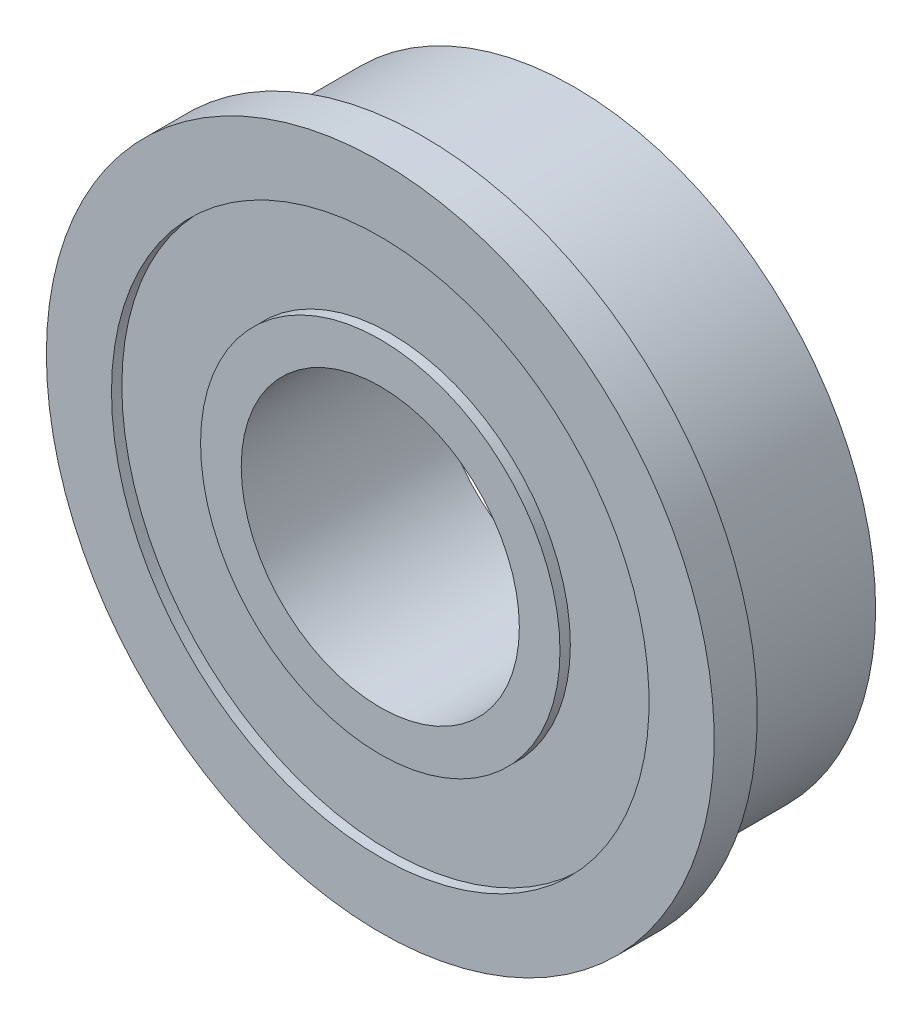
ISO-10303-21;
HEADER;
FILE_DESCRIPTION(('STEP AP214'),'2;1');
FILE_NAME('part.step','',(''),(''),'','','');
FILE_SCHEMA(('AUTOMOTIVE_DESIGN { 1 0 10303 214 1 1 1 1 }'));
ENDSEC;
DATA;
#1=APPLICATION_CONTEXT('core data for automotive mechanical design processes');
#2=APPLICATION_PROTOCOL_DEFINITION('international standard','automotive_design',2000,#1);
#3=PRODUCT_CONTEXT('',#1,'mechanical');
#4=PRODUCT('Part','Part','',(#3));
#5=PRODUCT_RELATED_PRODUCT_CATEGORY('part','',(#4));
#6=PRODUCT_DEFINITION_FORMATION('','',#4);
#7=PRODUCT_DEFINITION_CONTEXT('part definition',#1,'design');
#8=PRODUCT_DEFINITION('design','',#6,#7);
#9=PRODUCT_DEFINITION_SHAPE('','',#8);
#10=(LENGTH_UNIT() NAMED_UNIT(*) SI_UNIT(.MILLI.,.METRE.));
#11=(NAMED_UNIT(*) PLANE_ANGLE_UNIT() SI_UNIT($,.RADIAN.));
#12=(NAMED_UNIT(*) SI_UNIT($,.STERADIAN.) SOLID_ANGLE_UNIT());
#13=UNCERTAINTY_MEASURE_WITH_UNIT(LENGTH_MEASURE(1.E-05),#10,'distance_accuracy_value','');
#14=(GEOMETRIC_REPRESENTATION_CONTEXT(3) GLOBAL_UNCERTAINTY_ASSIGNED_CONTEXT((#13)) GLOBAL_UNIT_ASSIGNED_CONTEXT((#10,
#11,#12)) REPRESENTATION_CONTEXT('',''));
#15=CARTESIAN_POINT('',(0.,0.,0.));
#16=DIRECTION('',(0.,0.,1.));
#17=DIRECTION('',(1.,0.,0.));
#18=AXIS2_PLACEMENT_3D('',#15,#16,#17);
#19=CARTESIAN_POINT('',(0.,0.,0.));
#20=DIRECTION('',(0.,0.,-1.));
#21=DIRECTION('',(-1.,0.,0.));
#22=AXIS2_PLACEMENT_3D('',#19,#20,#21);
#23=CYLINDRICAL_SURFACE('',#22,5.125);
#24=CARTESIAN_POINT('',(0.,0.,7.14375));
#25=DIRECTION('',(0.,0.,-1.));
#26=DIRECTION('',(-1.,0.,0.));
#27=AXIS2_PLACEMENT_3D('',#24,#25,#26);
#28=CIRCLE('',#27,5.125);
#29=CARTESIAN_POINT('',(-5.125,0.,7.14375));
#30=VERTEX_POINT('',#29);
#31=EDGE_CURVE('E76',#30,#30,#28,.T.);
#32=ORIENTED_EDGE('',*,*,#31,.F.);
#33=EDGE_LOOP('',(#32));
#34=FACE_BOUND('',#33,.T.);
#35=CARTESIAN_POINT('',(0.,0.,0.));
#36=DIRECTION('',(0.,0.,-1.));
#37=DIRECTION('',(-1.,0.,0.));
#38=AXIS2_PLACEMENT_3D('',#35,#36,#37);
#39=CIRCLE('',#38,5.125);
#40=CARTESIAN_POINT('',(-5.125,0.,0.));
#41=VERTEX_POINT('',#40);
#42=EDGE_CURVE('E10',#41,#41,#39,.T.);
#43=ORIENTED_EDGE('',*,*,#42,.T.);
#44=EDGE_LOOP('',(#43));
#45=FACE_BOUND('',#44,.T.);
#46=ADVANCED_FACE('F15',(#34,#45),#23,.F.);
#47=CARTESIAN_POINT('',(5.8743,0.,0.));
#48=DIRECTION('',(0.,0.,1.));
#49=DIRECTION('',(1.,0.,0.));
#50=AXIS2_PLACEMENT_3D('',#47,#48,#49);
#51=PLANE('',#50);
#52=ORIENTED_EDGE('',*,*,#42,.F.);
#53=EDGE_LOOP('',(#52));
#54=FACE_BOUND('',#53,.T.);
#55=CARTESIAN_POINT('',(0.,0.,0.));
#56=DIRECTION('',(0.,0.,-1.));
#57=DIRECTION('',(-1.,0.,0.));
#58=AXIS2_PLACEMENT_3D('',#55,#56,#57);
#59=CIRCLE('',#58,6.6236);
#60=CARTESIAN_POINT('',(-6.6236,0.,0.));
#61=VERTEX_POINT('',#60);
#62=EDGE_CURVE('E22',#61,#61,#59,.T.);
#63=ORIENTED_EDGE('',*,*,#62,.T.);
#64=EDGE_LOOP('',(#63));
#65=FACE_BOUND('',#64,.T.);
#66=ADVANCED_FACE('F83',(#54,#65),#51,.F.);
#67=CARTESIAN_POINT('',(0.,0.,0.));
#68=DIRECTION('',(0.,0.,-1.));
#69=DIRECTION('',(-1.,0.,0.));
#70=AXIS2_PLACEMENT_3D('',#67,#68,#69);
#71=CYLINDRICAL_SURFACE('',#70,6.6236);
#72=ORIENTED_EDGE('',*,*,#62,.F.);
#73=EDGE_LOOP('',(#72));
#74=FACE_BOUND('',#73,.T.);
#75=CARTESIAN_POINT('',(0.,0.,0.381));
#76=DIRECTION('',(0.,0.,-1.));
#77=DIRECTION('',(-1.,0.,0.));
#78=AXIS2_PLACEMENT_3D('',#75,#76,#77);
#79=CIRCLE('',#78,6.6236);
#80=CARTESIAN_POINT('',(-6.6236,0.,0.381));
#81=VERTEX_POINT('',#80);
#82=EDGE_CURVE('E30',#81,#81,#79,.T.);
#83=ORIENTED_EDGE('',*,*,#82,.T.);
#84=EDGE_LOOP('',(#83));
#85=FACE_BOUND('',#84,.T.);
#86=ADVANCED_FACE('F87',(#74,#85),#71,.T.);
#87=CARTESIAN_POINT('',(8.2648,0.,0.381));
#88=DIRECTION('',(0.,0.,1.));
#89=DIRECTION('',(1.,0.,0.));
#90=AXIS2_PLACEMENT_3D('',#87,#88,#89);
#91=PLANE('',#90);
#92=ORIENTED_EDGE('',*,*,#82,.F.);
#93=EDGE_LOOP('',(#92));
#94=FACE_BOUND('',#93,.T.);
#95=CARTESIAN_POINT('',(0.,0.,0.381));
#96=DIRECTION('',(0.,0.,-1.));
#97=DIRECTION('',(-1.,0.,0.));
#98=AXIS2_PLACEMENT_3D('',#95,#96,#97);
#99=CIRCLE('',#98,9.906);
#100=CARTESIAN_POINT('',(-9.906,0.,0.381));
#101=VERTEX_POINT('',#100);
#102=EDGE_CURVE('E37',#101,#101,#99,.T.);
#103=ORIENTED_EDGE('',*,*,#102,.T.);
#104=EDGE_LOOP('',(#103));
#105=FACE_BOUND('',#104,.T.);
#106=ADVANCED_FACE('F91',(#94,#105),#91,.F.);
#107=CARTESIAN_POINT('',(0.,0.,0.));
#108=DIRECTION('',(0.,0.,-1.));
#109=DIRECTION('',(-1.,0.,0.));
#110=AXIS2_PLACEMENT_3D('',#107,#108,#109);
#111=CYLINDRICAL_SURFACE('',#110,9.906);
#112=ORIENTED_EDGE('',*,*,#102,.F.);
#113=EDGE_LOOP('',(#112));
#114=FACE_BOUND('',#113,.T.);
#115=CARTESIAN_POINT('',(0.,0.,0.));
#116=DIRECTION('',(0.,0.,-1.));
#117=DIRECTION('',(-1.,0.,0.));
#118=AXIS2_PLACEMENT_3D('',#115,#116,#117);
#119=CIRCLE('',#118,9.906);
#120=CARTESIAN_POINT('',(-9.906,0.,0.));
#121=VERTEX_POINT('',#120);
#122=EDGE_CURVE('E42',#121,#121,#119,.T.);
#123=ORIENTED_EDGE('',*,*,#122,.T.);
#124=EDGE_LOOP('',(#123));
#125=FACE_BOUND('',#124,.T.);
#126=ADVANCED_FACE('F97',(#114,#125),#111,.F.);
#127=CARTESIAN_POINT('',(10.50925,0.,0.));
#128=DIRECTION('',(0.,0.,1.));
#129=DIRECTION('',(1.,0.,0.));
#130=AXIS2_PLACEMENT_3D('',#127,#128,#129);
#131=PLANE('',#130);
#132=ORIENTED_EDGE('',*,*,#122,.F.);
#133=EDGE_LOOP('',(#132));
#134=FACE_BOUND('',#133,.T.);
#135=CARTESIAN_POINT('',(0.,0.,0.));
#136=DIRECTION('',(0.,0.,-1.));
#137=DIRECTION('',(-1.,0.,0.));
#138=AXIS2_PLACEMENT_3D('',#135,#136,#137);
#139=CIRCLE('',#138,11.1125);
#140=CARTESIAN_POINT('',(-11.1125,0.,0.));
#141=VERTEX_POINT('',#140);
#142=EDGE_CURVE('E46',#141,#141,#139,.T.);
#143=ORIENTED_EDGE('',*,*,#142,.T.);
#144=EDGE_LOOP('',(#143));
#145=FACE_BOUND('',#144,.T.);
#146=ADVANCED_FACE('F101',(#134,#145),#131,.F.);
#147=CARTESIAN_POINT('',(0.,0.,0.));
#148=DIRECTION('',(0.,0.,-1.));
#149=DIRECTION('',(-1.,0.,0.));
#150=AXIS2_PLACEMENT_3D('',#147,#148,#149);
#151=CYLINDRICAL_SURFACE('',#150,11.1125);
#152=ORIENTED_EDGE('',*,*,#142,.F.);
#153=EDGE_LOOP('',(#152));
#154=FACE_BOUND('',#153,.T.);
#155=CARTESIAN_POINT('',(0.,0.,5.55625));
#156=DIRECTION('',(0.,0.,-1.));
#157=DIRECTION('',(-1.,0.,0.));
#158=AXIS2_PLACEMENT_3D('',#155,#156,#157);
#159=CIRCLE('',#158,11.1125);
#160=CARTESIAN_POINT('',(-11.1125,0.,5.55625));
#161=VERTEX_POINT('',#160);
#162=EDGE_CURVE('E50',#161,#161,#159,.T.);
#163=ORIENTED_EDGE('',*,*,#162,.T.);
#164=EDGE_LOOP('',(#163));
#165=FACE_BOUND('',#164,.T.);
#166=ADVANCED_FACE('F105',(#154,#165),#151,.T.);
#167=CARTESIAN_POINT('',(11.7094,0.,5.55625));
#168=DIRECTION('',(0.,0.,1.));
#169=DIRECTION('',(1.,0.,0.));
#170=AXIS2_PLACEMENT_3D('',#167,#168,#169);
#171=PLANE('',#170);
#172=ORIENTED_EDGE('',*,*,#162,.F.);
#173=EDGE_LOOP('',(#172));
#174=FACE_BOUND('',#173,.T.);
#175=CARTESIAN_POINT('',(0.,0.,5.55625));
#176=DIRECTION('',(0.,0.,-1.));
#177=DIRECTION('',(-1.,0.,0.));
#178=AXIS2_PLACEMENT_3D('',#175,#176,#177);
#179=CIRCLE('',#178,12.3063);
#180=CARTESIAN_POINT('',(-12.3063,0.,5.55625));
#181=VERTEX_POINT('',#180);
#182=EDGE_CURVE('E54',#181,#181,#179,.T.);
#183=ORIENTED_EDGE('',*,*,#182,.T.);
#184=EDGE_LOOP('',(#183));
#185=FACE_BOUND('',#184,.T.);
#186=ADVANCED_FACE('F109',(#174,#185),#171,.F.);
#187=CARTESIAN_POINT('',(0.,0.,0.));
#188=DIRECTION('',(0.,0.,-1.));
#189=DIRECTION('',(-1.,0.,0.));
#190=AXIS2_PLACEMENT_3D('',#187,#188,#189);
#191=CYLINDRICAL_SURFACE('',#190,12.3063);
#192=ORIENTED_EDGE('',*,*,#182,.F.);
#193=EDGE_LOOP('',(#192));
#194=FACE_BOUND('',#193,.T.);
#195=CARTESIAN_POINT('',(0.,0.,7.14375));
#196=DIRECTION('',(0.,0.,-1.));
#197=DIRECTION('',(-1.,0.,0.));
#198=AXIS2_PLACEMENT_3D('',#195,#196,#197);
#199=CIRCLE('',#198,12.3063);
#200=CARTESIAN_POINT('',(-12.3063,0.,7.14375));
#201=VERTEX_POINT('',#200);
#202=EDGE_CURVE('E57',#201,#201,#199,.T.);
#203=ORIENTED_EDGE('',*,*,#202,.T.);
#204=EDGE_LOOP('',(#203));
#205=FACE_BOUND('',#204,.T.);
#206=ADVANCED_FACE('F113',(#194,#205),#191,.T.);
#207=CARTESIAN_POINT('',(11.10615,0.,7.14375));
#208=DIRECTION('',(0.,0.,-1.));
#209=DIRECTION('',(-1.,0.,0.));
#210=AXIS2_PLACEMENT_3D('',#207,#208,#209);
#211=PLANE('',#210);
#212=ORIENTED_EDGE('',*,*,#202,.F.);
#213=EDGE_LOOP('',(#212));
#214=FACE_BOUND('',#213,.T.);
#215=CARTESIAN_POINT('',(0.,0.,7.14375));
#216=DIRECTION('',(0.,0.,-1.));
#217=DIRECTION('',(-1.,0.,0.));
#218=AXIS2_PLACEMENT_3D('',#215,#216,#217);
#219=CIRCLE('',#218,9.906);
#220=CARTESIAN_POINT('',(-9.906,0.,7.14375));
#221=VERTEX_POINT('',#220);
#222=EDGE_CURVE('E61',#221,#221,#219,.T.);
#223=ORIENTED_EDGE('',*,*,#222,.T.);
#224=EDGE_LOOP('',(#223));
#225=FACE_BOUND('',#224,.T.);
#226=ADVANCED_FACE('F117',(#214,#225),#211,.F.);
#227=CARTESIAN_POINT('',(0.,0.,0.));
#228=DIRECTION('',(0.,0.,-1.));
#229=DIRECTION('',(-1.,0.,0.));
#230=AXIS2_PLACEMENT_3D('',#227,#228,#229);
#231=CYLINDRICAL_SURFACE('',#230,9.906);
#232=ORIENTED_EDGE('',*,*,#222,.F.);
#233=EDGE_LOOP('',(#232));
#234=FACE_BOUND('',#233,.T.);
#235=CARTESIAN_POINT('',(0.,0.,6.76275));
#236=DIRECTION('',(0.,0.,-1.));
#237=DIRECTION('',(-1.,0.,0.));
#238=AXIS2_PLACEMENT_3D('',#235,#236,#237);
#239=CIRCLE('',#238,9.906);
#240=CARTESIAN_POINT('',(-9.906,0.,6.76275));
#241=VERTEX_POINT('',#240);
#242=EDGE_CURVE('E64',#241,#241,#239,.T.);
#243=ORIENTED_EDGE('',*,*,#242,.T.);
#244=EDGE_LOOP('',(#243));
#245=FACE_BOUND('',#244,.T.);
#246=ADVANCED_FACE('F121',(#234,#245),#231,.F.);
#247=CARTESIAN_POINT('',(8.2648,0.,6.76275));
#248=DIRECTION('',(0.,0.,-1.));
#249=DIRECTION('',(-1.,0.,0.));
#250=AXIS2_PLACEMENT_3D('',#247,#248,#249);
#251=PLANE('',#250);
#252=ORIENTED_EDGE('',*,*,#242,.F.);
#253=EDGE_LOOP('',(#252));
#254=FACE_BOUND('',#253,.T.);
#255=CARTESIAN_POINT('',(0.,0.,6.76275));
#256=DIRECTION('',(0.,0.,-1.));
#257=DIRECTION('',(-1.,0.,0.));
#258=AXIS2_PLACEMENT_3D('',#255,#256,#257);
#259=CIRCLE('',#258,6.6236);
#260=CARTESIAN_POINT('',(-6.6236,0.,6.76275));
#261=VERTEX_POINT('',#260);
#262=EDGE_CURVE('E68',#261,#261,#259,.T.);
#263=ORIENTED_EDGE('',*,*,#262,.T.);
#264=EDGE_LOOP('',(#263));
#265=FACE_BOUND('',#264,.T.);
#266=ADVANCED_FACE('F125',(#254,#265),#251,.F.);
#267=CARTESIAN_POINT('',(0.,0.,0.));
#268=DIRECTION('',(0.,0.,-1.));
#269=DIRECTION('',(-1.,0.,0.));
#270=AXIS2_PLACEMENT_3D('',#267,#268,#269);
#271=CYLINDRICAL_SURFACE('',#270,6.6236);
#272=ORIENTED_EDGE('',*,*,#262,.F.);
#273=EDGE_LOOP('',(#272));
#274=FACE_BOUND('',#273,.T.);
#275=CARTESIAN_POINT('',(0.,0.,7.14375));
#276=DIRECTION('',(0.,0.,-1.));
#277=DIRECTION('',(-1.,0.,0.));
#278=AXIS2_PLACEMENT_3D('',#275,#276,#277);
#279=CIRCLE('',#278,6.6236);
#280=CARTESIAN_POINT('',(-6.6236,0.,7.14375));
#281=VERTEX_POINT('',#280);
#282=EDGE_CURVE('E72',#281,#281,#279,.T.);
#283=ORIENTED_EDGE('',*,*,#282,.T.);
#284=EDGE_LOOP('',(#283));
#285=FACE_BOUND('',#284,.T.);
#286=ADVANCED_FACE('F129',(#274,#285),#271,.T.);
#287=CARTESIAN_POINT('',(5.8743,0.,7.14375));
#288=DIRECTION('',(0.,0.,-1.));
#289=DIRECTION('',(-1.,0.,0.));
#290=AXIS2_PLACEMENT_3D('',#287,#288,#289);
#291=PLANE('',#290);
#292=ORIENTED_EDGE('',*,*,#282,.F.);
#293=EDGE_LOOP('',(#292));
#294=FACE_BOUND('',#293,.T.);
#295=ORIENTED_EDGE('',*,*,#31,.T.);
#296=EDGE_LOOP('',(#295));
#297=FACE_BOUND('',#296,.T.);
#298=ADVANCED_FACE('F80',(#294,#297),#291,.F.);
#299=CLOSED_SHELL('',(#46,#66,#86,#106,#126,#146,#166,#186,#206,#226,#246,#266,#286,#298));
#300=MANIFOLD_SOLID_BREP('B1',#299);
#301=ADVANCED_BREP_SHAPE_REPRESENTATION('',(#18,#300),#14);
#302=SHAPE_DEFINITION_REPRESENTATION(#9,#301);
ENDSEC;
END-ISO-10303-21;
